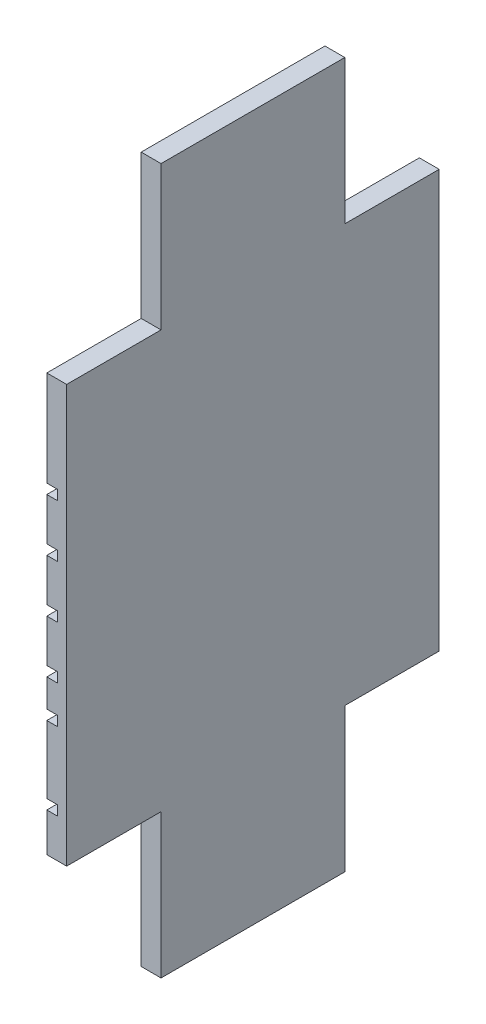
ISO-10303-21;
HEADER;
FILE_DESCRIPTION(('STEP AP214'),'2;1');
FILE_NAME('part.step','',(''),(''),'','','');
FILE_SCHEMA(('AUTOMOTIVE_DESIGN { 1 0 10303 214 1 1 1 1 }'));
ENDSEC;
DATA;
#1=APPLICATION_CONTEXT('core data for automotive mechanical design processes');
#2=APPLICATION_PROTOCOL_DEFINITION('international standard','automotive_design',2000,#1);
#3=PRODUCT_CONTEXT('',#1,'mechanical');
#4=PRODUCT('Part','Part','',(#3));
#5=PRODUCT_RELATED_PRODUCT_CATEGORY('part','',(#4));
#6=PRODUCT_DEFINITION_FORMATION('','',#4);
#7=PRODUCT_DEFINITION_CONTEXT('part definition',#1,'design');
#8=PRODUCT_DEFINITION('design','',#6,#7);
#9=PRODUCT_DEFINITION_SHAPE('','',#8);
#10=(LENGTH_UNIT() NAMED_UNIT(*) SI_UNIT(.MILLI.,.METRE.));
#11=(NAMED_UNIT(*) PLANE_ANGLE_UNIT() SI_UNIT($,.RADIAN.));
#12=(NAMED_UNIT(*) SI_UNIT($,.STERADIAN.) SOLID_ANGLE_UNIT());
#13=UNCERTAINTY_MEASURE_WITH_UNIT(LENGTH_MEASURE(1.E-05),#10,'distance_accuracy_value','');
#14=(GEOMETRIC_REPRESENTATION_CONTEXT(3) GLOBAL_UNCERTAINTY_ASSIGNED_CONTEXT((#13)) GLOBAL_UNIT_ASSIGNED_CONTEXT((#10,
#11,#12)) REPRESENTATION_CONTEXT('',''));
#15=CARTESIAN_POINT('',(0.,0.,0.));
#16=DIRECTION('',(0.,0.,1.));
#17=DIRECTION('',(1.,0.,0.));
#18=AXIS2_PLACEMENT_3D('',#15,#16,#17);
#19=CARTESIAN_POINT('',(102.,-8.,1.35513401620469E-13));
#20=DIRECTION('',(0.,1.,0.));
#21=DIRECTION('',(0.,0.,1.));
#22=AXIS2_PLACEMENT_3D('',#19,#20,#21);
#23=PLANE('',#22);
#24=DIRECTION('',(1.,0.,0.));
#25=VECTOR('',#24,1.);
#26=CARTESIAN_POINT('',(102.,-8.00000000000078,-55.9999999999988));
#27=LINE('',#26,#25);
#28=CARTESIAN_POINT('',(98.,-8.00000000000078,-55.9999999999988));
#29=VERTEX_POINT('',#28);
#30=CARTESIAN_POINT('',(102.,-8.00000000000078,-55.9999999999988));
#31=VERTEX_POINT('',#30);
#32=EDGE_CURVE('E286',#29,#31,#27,.T.);
#33=ORIENTED_EDGE('',*,*,#32,.F.);
#34=DIRECTION('',(0.,0.,-1.));
#35=VECTOR('',#34,1.);
#36=CARTESIAN_POINT('',(98.,-8.,1.36253550303553E-13));
#37=LINE('',#36,#35);
#38=CARTESIAN_POINT('',(98.,-8.00000000000105,-74.9999999999999));
#39=VERTEX_POINT('',#38);
#40=EDGE_CURVE('E357',#29,#39,#37,.T.);
#41=ORIENTED_EDGE('',*,*,#40,.T.);
#42=DIRECTION('',(-1.,0.,0.));
#43=VECTOR('',#42,1.);
#44=CARTESIAN_POINT('',(102.,-8.00000000000105,-74.9999999999999));
#45=LINE('',#44,#43);
#46=CARTESIAN_POINT('',(102.,-8.00000000000105,-74.9999999999999));
#47=VERTEX_POINT('',#46);
#48=EDGE_CURVE('E421',#47,#39,#45,.T.);
#49=ORIENTED_EDGE('',*,*,#48,.F.);
#50=DIRECTION('',(0.,0.,-1.));
#51=VECTOR('',#50,1.);
#52=CARTESIAN_POINT('',(102.,-8.,1.35513401620469E-13));
#53=LINE('',#52,#51);
#54=EDGE_CURVE('E50',#31,#47,#53,.T.);
#55=ORIENTED_EDGE('',*,*,#54,.F.);
#56=EDGE_LOOP('',(#33,#41,#49,#55));
#57=FACE_BOUND('',#56,.T.);
#58=ADVANCED_FACE('F33',(#57),#23,.F.);
#59=DIRECTION('',(-1.,0.,0.));
#60=VECTOR('',#59,1.);
#61=CARTESIAN_POINT('',(102.,-8.00000000000027,-18.9999999999989));
#62=LINE('',#61,#60);
#63=CARTESIAN_POINT('',(102.,-8.00000000000027,-18.9999999999989));
#64=VERTEX_POINT('',#63);
#65=CARTESIAN_POINT('',(98.,-8.00000000000027,-18.9999999999989));
#66=VERTEX_POINT('',#65);
#67=EDGE_CURVE('E58',#64,#66,#62,.T.);
#68=ORIENTED_EDGE('',*,*,#67,.F.);
#69=CARTESIAN_POINT('',(102.,-8.,1.35513401620469E-13));
#70=VERTEX_POINT('',#69);
#71=EDGE_CURVE('E290',#70,#64,#53,.T.);
#72=ORIENTED_EDGE('',*,*,#71,.F.);
#73=DIRECTION('',(-1.,0.,0.));
#74=VECTOR('',#73,1.);
#75=CARTESIAN_POINT('',(102.,-8.,1.35513401620469E-13));
#76=LINE('',#75,#74);
#77=CARTESIAN_POINT('',(98.,-8.,1.36253550303553E-13));
#78=VERTEX_POINT('',#77);
#79=EDGE_CURVE('E418',#70,#78,#76,.T.);
#80=ORIENTED_EDGE('',*,*,#79,.T.);
#81=EDGE_CURVE('E353',#78,#66,#37,.T.);
#82=ORIENTED_EDGE('',*,*,#81,.T.);
#83=EDGE_LOOP('',(#68,#72,#80,#82));
#84=FACE_BOUND('',#83,.T.);
#85=ADVANCED_FACE('F455',(#84),#23,.F.);
#86=CARTESIAN_POINT('',(102.,76.,1.35513401620469E-13));
#87=DIRECTION('',(0.,-1.,0.));
#88=DIRECTION('',(0.,0.,-1.));
#89=AXIS2_PLACEMENT_3D('',#86,#87,#88);
#90=PLANE('',#89);
#91=DIRECTION('',(-1.,0.,0.));
#92=VECTOR('',#91,1.);
#93=CARTESIAN_POINT('',(98.,76.,-56.));
#94=LINE('',#93,#92);
#95=CARTESIAN_POINT('',(102.,76.,-56.));
#96=VERTEX_POINT('',#95);
#97=CARTESIAN_POINT('',(98.,76.,-56.));
#98=VERTEX_POINT('',#97);
#99=EDGE_CURVE('E294',#96,#98,#94,.T.);
#100=ORIENTED_EDGE('',*,*,#99,.F.);
#101=DIRECTION('',(0.,0.,1.));
#102=VECTOR('',#101,1.);
#103=CARTESIAN_POINT('',(102.,76.,1.35513401620469E-13));
#104=LINE('',#103,#102);
#105=CARTESIAN_POINT('',(102.,76.,-74.9999999999999));
#106=VERTEX_POINT('',#105);
#107=EDGE_CURVE('E430',#106,#96,#104,.T.);
#108=ORIENTED_EDGE('',*,*,#107,.F.);
#109=DIRECTION('',(-1.,0.,0.));
#110=VECTOR('',#109,1.);
#111=CARTESIAN_POINT('',(102.,76.,-74.9999999999999));
#112=LINE('',#111,#110);
#113=CARTESIAN_POINT('',(98.,76.,-74.9999999999999));
#114=VERTEX_POINT('',#113);
#115=EDGE_CURVE('E423',#106,#114,#112,.T.);
#116=ORIENTED_EDGE('',*,*,#115,.T.);
#117=DIRECTION('',(0.,0.,1.));
#118=VECTOR('',#117,1.);
#119=CARTESIAN_POINT('',(98.,76.,1.36253550303553E-13));
#120=LINE('',#119,#118);
#121=EDGE_CURVE('E376',#114,#98,#120,.T.);
#122=ORIENTED_EDGE('',*,*,#121,.T.);
#123=EDGE_LOOP('',(#100,#108,#116,#122));
#124=FACE_BOUND('',#123,.T.);
#125=ADVANCED_FACE('F651',(#124),#90,.F.);
#126=DIRECTION('',(1.,0.,0.));
#127=VECTOR('',#126,1.);
#128=CARTESIAN_POINT('',(98.,76.,-19.));
#129=LINE('',#128,#127);
#130=CARTESIAN_POINT('',(98.,76.,-19.));
#131=VERTEX_POINT('',#130);
#132=CARTESIAN_POINT('',(102.,76.,-19.));
#133=VERTEX_POINT('',#132);
#134=EDGE_CURVE('E291',#131,#133,#129,.T.);
#135=ORIENTED_EDGE('',*,*,#134,.F.);
#136=CARTESIAN_POINT('',(98.,76.,1.36253550303553E-13));
#137=VERTEX_POINT('',#136);
#138=EDGE_CURVE('E367',#131,#137,#120,.T.);
#139=ORIENTED_EDGE('',*,*,#138,.T.);
#140=DIRECTION('',(-1.,0.,0.));
#141=VECTOR('',#140,1.);
#142=CARTESIAN_POINT('',(102.,76.,1.35513401620469E-13));
#143=LINE('',#142,#141);
#144=CARTESIAN_POINT('',(102.,76.,1.35513401620469E-13));
#145=VERTEX_POINT('',#144);
#146=EDGE_CURVE('E371',#145,#137,#143,.T.);
#147=ORIENTED_EDGE('',*,*,#146,.F.);
#148=EDGE_CURVE('E328',#133,#145,#104,.T.);
#149=ORIENTED_EDGE('',*,*,#148,.F.);
#150=EDGE_LOOP('',(#135,#139,#147,#149));
#151=FACE_BOUND('',#150,.T.);
#152=ADVANCED_FACE('F664',(#151),#90,.F.);
#153=CARTESIAN_POINT('',(102.,-8.,1.35513401620469E-13));
#154=DIRECTION('',(0.,0.,-1.));
#155=DIRECTION('',(-1.,0.,0.));
#156=AXIS2_PLACEMENT_3D('',#153,#154,#155);
#157=PLANE('',#156);
#158=DIRECTION('',(-1.,0.,0.));
#159=VECTOR('',#158,1.);
#160=CARTESIAN_POINT('',(102.,56.7875,1.35513401620469E-13));
#161=LINE('',#160,#159);
#162=CARTESIAN_POINT('',(100.2,56.7875,1.38777878078145E-13));
#163=VERTEX_POINT('',#162);
#164=CARTESIAN_POINT('',(98.,56.7875,1.36253550400505E-13));
#165=VERTEX_POINT('',#164);
#166=EDGE_CURVE('E570',#163,#165,#161,.T.);
#167=ORIENTED_EDGE('',*,*,#166,.F.);
#168=DIRECTION('',(0.,1.,0.));
#169=VECTOR('',#168,1.);
#170=CARTESIAN_POINT('',(100.2,-8.,1.35846468527857E-13));
#171=LINE('',#170,#169);
#172=CARTESIAN_POINT('',(100.2,54.8,1.38777878078145E-13));
#173=VERTEX_POINT('',#172);
#174=EDGE_CURVE('E566',#173,#163,#171,.T.);
#175=ORIENTED_EDGE('',*,*,#174,.F.);
#176=DIRECTION('',(-1.,0.,0.));
#177=VECTOR('',#176,1.);
#178=CARTESIAN_POINT('',(102.,54.8,1.35513401620469E-13));
#179=LINE('',#178,#177);
#180=CARTESIAN_POINT('',(98.,54.8,1.36253550400505E-13));
#181=VERTEX_POINT('',#180);
#182=EDGE_CURVE('E574',#173,#181,#179,.T.);
#183=ORIENTED_EDGE('',*,*,#182,.T.);
#184=DIRECTION('',(0.,-1.,0.));
#185=VECTOR('',#184,1.);
#186=CARTESIAN_POINT('',(98.,-8.,1.36253550303553E-13));
#187=LINE('',#186,#185);
#188=CARTESIAN_POINT('',(98.,46.1875,1.36253550400505E-13));
#189=VERTEX_POINT('',#188);
#190=EDGE_CURVE('E467',#181,#189,#187,.T.);
#191=ORIENTED_EDGE('',*,*,#190,.T.);
#192=DIRECTION('',(-1.,0.,0.));
#193=VECTOR('',#192,1.);
#194=CARTESIAN_POINT('',(102.,46.1875,1.35513401620469E-13));
#195=LINE('',#194,#193);
#196=CARTESIAN_POINT('',(100.2,46.1875,1.38777878078145E-13));
#197=VERTEX_POINT('',#196);
#198=EDGE_CURVE('E551',#197,#189,#195,.T.);
#199=ORIENTED_EDGE('',*,*,#198,.F.);
#200=DIRECTION('',(0.,1.,0.));
#201=VECTOR('',#200,1.);
#202=CARTESIAN_POINT('',(100.2,-8.,1.35846468527857E-13));
#203=LINE('',#202,#201);
#204=CARTESIAN_POINT('',(100.2,44.2,1.38777878078145E-13));
#205=VERTEX_POINT('',#204);
#206=EDGE_CURVE('E547',#205,#197,#203,.T.);
#207=ORIENTED_EDGE('',*,*,#206,.F.);
#208=DIRECTION('',(-1.,0.,0.));
#209=VECTOR('',#208,1.);
#210=CARTESIAN_POINT('',(102.,44.2,1.35513401620469E-13));
#211=LINE('',#210,#209);
#212=CARTESIAN_POINT('',(98.,44.2,1.36253550400505E-13));
#213=VERTEX_POINT('',#212);
#214=EDGE_CURVE('E556',#205,#213,#211,.T.);
#215=ORIENTED_EDGE('',*,*,#214,.T.);
#216=CARTESIAN_POINT('',(98.,35.5875,1.36253550400505E-13));
#217=VERTEX_POINT('',#216);
#218=EDGE_CURVE('E468',#213,#217,#187,.T.);
#219=ORIENTED_EDGE('',*,*,#218,.T.);
#220=DIRECTION('',(-1.,0.,0.));
#221=VECTOR('',#220,1.);
#222=CARTESIAN_POINT('',(102.,35.5875,1.35513401620469E-13));
#223=LINE('',#222,#221);
#224=CARTESIAN_POINT('',(100.2,35.5875,1.38777878078145E-13));
#225=VERTEX_POINT('',#224);
#226=EDGE_CURVE('E532',#225,#217,#223,.T.);
#227=ORIENTED_EDGE('',*,*,#226,.F.);
#228=DIRECTION('',(0.,1.,0.));
#229=VECTOR('',#228,1.);
#230=CARTESIAN_POINT('',(100.2,-8.,1.35846468527857E-13));
#231=LINE('',#230,#229);
#232=CARTESIAN_POINT('',(100.2,33.6,1.38777878078145E-13));
#233=VERTEX_POINT('',#232);
#234=EDGE_CURVE('E528',#233,#225,#231,.T.);
#235=ORIENTED_EDGE('',*,*,#234,.F.);
#236=DIRECTION('',(-1.,0.,0.));
#237=VECTOR('',#236,1.);
#238=CARTESIAN_POINT('',(102.,33.6,1.35513401620469E-13));
#239=LINE('',#238,#237);
#240=CARTESIAN_POINT('',(98.,33.6,1.36253550400505E-13));
#241=VERTEX_POINT('',#240);
#242=EDGE_CURVE('E537',#233,#241,#239,.T.);
#243=ORIENTED_EDGE('',*,*,#242,.T.);
#244=CARTESIAN_POINT('',(98.,24.9875,1.36253550400505E-13));
#245=VERTEX_POINT('',#244);
#246=EDGE_CURVE('E624',#241,#245,#187,.T.);
#247=ORIENTED_EDGE('',*,*,#246,.T.);
#248=DIRECTION('',(-1.,0.,0.));
#249=VECTOR('',#248,1.);
#250=CARTESIAN_POINT('',(102.,24.9875,1.35513401620469E-13));
#251=LINE('',#250,#249);
#252=CARTESIAN_POINT('',(100.2,24.9875,1.38777878078145E-13));
#253=VERTEX_POINT('',#252);
#254=EDGE_CURVE('E513',#253,#245,#251,.T.);
#255=ORIENTED_EDGE('',*,*,#254,.F.);
#256=DIRECTION('',(0.,1.,0.));
#257=VECTOR('',#256,1.);
#258=CARTESIAN_POINT('',(100.2,-8.,1.35846468527857E-13));
#259=LINE('',#258,#257);
#260=CARTESIAN_POINT('',(100.2,23.,1.38777878078145E-13));
#261=VERTEX_POINT('',#260);
#262=EDGE_CURVE('E511',#261,#253,#259,.T.);
#263=ORIENTED_EDGE('',*,*,#262,.F.);
#264=DIRECTION('',(-1.,0.,0.));
#265=VECTOR('',#264,1.);
#266=CARTESIAN_POINT('',(102.,23.,1.35513401620469E-13));
#267=LINE('',#266,#265);
#268=CARTESIAN_POINT('',(98.,23.,1.36253550400505E-13));
#269=VERTEX_POINT('',#268);
#270=EDGE_CURVE('E518',#261,#269,#267,.T.);
#271=ORIENTED_EDGE('',*,*,#270,.T.);
#272=CARTESIAN_POINT('',(98.,17.3875,1.36253550400505E-13));
#273=VERTEX_POINT('',#272);
#274=EDGE_CURVE('E471',#269,#273,#187,.T.);
#275=ORIENTED_EDGE('',*,*,#274,.T.);
#276=DIRECTION('',(1.,0.,0.));
#277=VECTOR('',#276,1.);
#278=CARTESIAN_POINT('',(102.,17.3875,1.35513401620469E-13));
#279=LINE('',#278,#277);
#280=CARTESIAN_POINT('',(100.2,17.3875,1.36050009415705E-13));
#281=VERTEX_POINT('',#280);
#282=EDGE_CURVE('E495',#273,#281,#279,.T.);
#283=ORIENTED_EDGE('',*,*,#282,.T.);
#284=DIRECTION('',(0.,1.,0.));
#285=VECTOR('',#284,1.);
#286=CARTESIAN_POINT('',(100.2,-8.,1.35846468527857E-13));
#287=LINE('',#286,#285);
#288=CARTESIAN_POINT('',(100.2,15.4,1.36050009415705E-13));
#289=VERTEX_POINT('',#288);
#290=EDGE_CURVE('E493',#289,#281,#287,.T.);
#291=ORIENTED_EDGE('',*,*,#290,.F.);
#292=DIRECTION('',(1.,0.,0.));
#293=VECTOR('',#292,1.);
#294=CARTESIAN_POINT('',(102.,15.4,1.35513401620469E-13));
#295=LINE('',#294,#293);
#296=CARTESIAN_POINT('',(98.,15.4,1.36253550400505E-13));
#297=VERTEX_POINT('',#296);
#298=EDGE_CURVE('E501',#297,#289,#295,.T.);
#299=ORIENTED_EDGE('',*,*,#298,.F.);
#300=CARTESIAN_POINT('',(98.,1.7875,1.36253550400505E-13));
#301=VERTEX_POINT('',#300);
#302=EDGE_CURVE('E469',#297,#301,#187,.T.);
#303=ORIENTED_EDGE('',*,*,#302,.T.);
#304=DIRECTION('',(-1.,0.,0.));
#305=VECTOR('',#304,1.);
#306=CARTESIAN_POINT('',(102.,1.7875,1.35513401620469E-13));
#307=LINE('',#306,#305);
#308=CARTESIAN_POINT('',(100.2,1.7875,1.38777878078145E-13));
#309=VERTEX_POINT('',#308);
#310=EDGE_CURVE('E472',#309,#301,#307,.T.);
#311=ORIENTED_EDGE('',*,*,#310,.F.);
#312=DIRECTION('',(0.,1.,0.));
#313=VECTOR('',#312,1.);
#314=CARTESIAN_POINT('',(100.2,-8.,1.35846468527857E-13));
#315=LINE('',#314,#313);
#316=CARTESIAN_POINT('',(100.2,-0.2,1.38777878078145E-13));
#317=VERTEX_POINT('',#316);
#318=EDGE_CURVE('E470',#317,#309,#315,.T.);
#319=ORIENTED_EDGE('',*,*,#318,.F.);
#320=DIRECTION('',(-1.,0.,0.));
#321=VECTOR('',#320,1.);
#322=CARTESIAN_POINT('',(102.,-0.2,1.35513401620469E-13));
#323=LINE('',#322,#321);
#324=CARTESIAN_POINT('',(98.,-0.2,1.36253550400505E-13));
#325=VERTEX_POINT('',#324);
#326=EDGE_CURVE('E483',#317,#325,#323,.T.);
#327=ORIENTED_EDGE('',*,*,#326,.T.);
#328=EDGE_CURVE('E453',#325,#78,#187,.T.);
#329=ORIENTED_EDGE('',*,*,#328,.T.);
#330=ORIENTED_EDGE('',*,*,#79,.F.);
#331=DIRECTION('',(0.,-1.,0.));
#332=VECTOR('',#331,1.);
#333=CARTESIAN_POINT('',(102.,-8.,1.35513401620469E-13));
#334=LINE('',#333,#332);
#335=EDGE_CURVE('E377',#145,#70,#334,.T.);
#336=ORIENTED_EDGE('',*,*,#335,.F.);
#337=ORIENTED_EDGE('',*,*,#146,.T.);
#338=EDGE_CURVE('E362',#137,#165,#187,.T.);
#339=ORIENTED_EDGE('',*,*,#338,.T.);
#340=EDGE_LOOP('',(#167,#175,#183,#191,#199,#207,#215,#219,#227,#235,#243,#247,#255,#263,#271,
#275,#283,#291,#299,#303,#311,#319,#327,#329,#330,#336,#337,#339));
#341=FACE_BOUND('',#340,.T.);
#342=ADVANCED_FACE('F35',(#341),#157,.F.);
#343=CARTESIAN_POINT('',(102.,-8.00000000000105,-74.9999999999999));
#344=DIRECTION('',(0.,0.,1.));
#345=DIRECTION('',(1.,0.,0.));
#346=AXIS2_PLACEMENT_3D('',#343,#344,#345);
#347=PLANE('',#346);
#348=DIRECTION('',(1.,0.,0.));
#349=VECTOR('',#348,1.);
#350=CARTESIAN_POINT('',(102.,56.7875,-74.9999999999999));
#351=LINE('',#350,#349);
#352=CARTESIAN_POINT('',(98.,56.7875,-74.9999999999999));
#353=VERTEX_POINT('',#352);
#354=CARTESIAN_POINT('',(100.2,56.7875,-74.9999999999999));
#355=VERTEX_POINT('',#354);
#356=EDGE_CURVE('E572',#353,#355,#351,.T.);
#357=ORIENTED_EDGE('',*,*,#356,.F.);
#358=DIRECTION('',(0.,1.,0.));
#359=VECTOR('',#358,1.);
#360=CARTESIAN_POINT('',(98.,-8.00000000000105,-74.9999999999999));
#361=LINE('',#360,#359);
#362=EDGE_CURVE('E356',#353,#114,#361,.T.);
#363=ORIENTED_EDGE('',*,*,#362,.T.);
#364=ORIENTED_EDGE('',*,*,#115,.F.);
#365=DIRECTION('',(0.,1.,0.));
#366=VECTOR('',#365,1.);
#367=CARTESIAN_POINT('',(102.,-8.00000000000105,-74.9999999999999));
#368=LINE('',#367,#366);
#369=EDGE_CURVE('E438',#47,#106,#368,.T.);
#370=ORIENTED_EDGE('',*,*,#369,.F.);
#371=ORIENTED_EDGE('',*,*,#48,.T.);
#372=CARTESIAN_POINT('',(98.,-0.2,-74.9999999999999));
#373=VERTEX_POINT('',#372);
#374=EDGE_CURVE('E363',#39,#373,#361,.T.);
#375=ORIENTED_EDGE('',*,*,#374,.T.);
#376=DIRECTION('',(1.,0.,0.));
#377=VECTOR('',#376,1.);
#378=CARTESIAN_POINT('',(102.,-0.2,-74.9999999999999));
#379=LINE('',#378,#377);
#380=CARTESIAN_POINT('',(100.2,-0.2,-74.9999999999999));
#381=VERTEX_POINT('',#380);
#382=EDGE_CURVE('E485',#373,#381,#379,.T.);
#383=ORIENTED_EDGE('',*,*,#382,.T.);
#384=DIRECTION('',(0.,-1.,0.));
#385=VECTOR('',#384,1.);
#386=CARTESIAN_POINT('',(100.2,-8.00000000000105,-74.9999999999999));
#387=LINE('',#386,#385);
#388=CARTESIAN_POINT('',(100.2,1.7875,-74.9999999999999));
#389=VERTEX_POINT('',#388);
#390=EDGE_CURVE('E411',#389,#381,#387,.T.);
#391=ORIENTED_EDGE('',*,*,#390,.F.);
#392=DIRECTION('',(1.,0.,0.));
#393=VECTOR('',#392,1.);
#394=CARTESIAN_POINT('',(102.,1.7875,-74.9999999999999));
#395=LINE('',#394,#393);
#396=CARTESIAN_POINT('',(98.,1.7875,-74.9999999999999));
#397=VERTEX_POINT('',#396);
#398=EDGE_CURVE('E479',#397,#389,#395,.T.);
#399=ORIENTED_EDGE('',*,*,#398,.F.);
#400=CARTESIAN_POINT('',(98.,15.4,-74.9999999999999));
#401=VERTEX_POINT('',#400);
#402=EDGE_CURVE('E368',#397,#401,#361,.T.);
#403=ORIENTED_EDGE('',*,*,#402,.T.);
#404=DIRECTION('',(-1.,0.,0.));
#405=VECTOR('',#404,1.);
#406=CARTESIAN_POINT('',(102.,15.4,-74.9999999999999));
#407=LINE('',#406,#405);
#408=CARTESIAN_POINT('',(100.2,15.4,-74.9999999999999));
#409=VERTEX_POINT('',#408);
#410=EDGE_CURVE('E503',#409,#401,#407,.T.);
#411=ORIENTED_EDGE('',*,*,#410,.F.);
#412=DIRECTION('',(0.,-1.,0.));
#413=VECTOR('',#412,1.);
#414=CARTESIAN_POINT('',(100.2,-8.00000000000105,-74.9999999999999));
#415=LINE('',#414,#413);
#416=CARTESIAN_POINT('',(100.2,17.3875,-74.9999999999999));
#417=VERTEX_POINT('',#416);
#418=EDGE_CURVE('E404',#417,#409,#415,.T.);
#419=ORIENTED_EDGE('',*,*,#418,.F.);
#420=DIRECTION('',(-1.,0.,0.));
#421=VECTOR('',#420,1.);
#422=CARTESIAN_POINT('',(102.,17.3875,-74.9999999999999));
#423=LINE('',#422,#421);
#424=CARTESIAN_POINT('',(98.,17.3875,-74.9999999999999));
#425=VERTEX_POINT('',#424);
#426=EDGE_CURVE('E498',#417,#425,#423,.T.);
#427=ORIENTED_EDGE('',*,*,#426,.T.);
#428=CARTESIAN_POINT('',(98.,23.,-74.9999999999999));
#429=VERTEX_POINT('',#428);
#430=EDGE_CURVE('E640',#425,#429,#361,.T.);
#431=ORIENTED_EDGE('',*,*,#430,.T.);
#432=DIRECTION('',(1.,0.,0.));
#433=VECTOR('',#432,1.);
#434=CARTESIAN_POINT('',(102.,23.,-74.9999999999999));
#435=LINE('',#434,#433);
#436=CARTESIAN_POINT('',(100.2,23.,-74.9999999999999));
#437=VERTEX_POINT('',#436);
#438=EDGE_CURVE('E521',#429,#437,#435,.T.);
#439=ORIENTED_EDGE('',*,*,#438,.T.);
#440=DIRECTION('',(0.,-1.,0.));
#441=VECTOR('',#440,1.);
#442=CARTESIAN_POINT('',(100.2,-8.00000000000105,-74.9999999999999));
#443=LINE('',#442,#441);
#444=CARTESIAN_POINT('',(100.2,24.9875,-74.9999999999999));
#445=VERTEX_POINT('',#444);
#446=EDGE_CURVE('E397',#445,#437,#443,.T.);
#447=ORIENTED_EDGE('',*,*,#446,.F.);
#448=DIRECTION('',(1.,0.,0.));
#449=VECTOR('',#448,1.);
#450=CARTESIAN_POINT('',(102.,24.9875,-74.9999999999999));
#451=LINE('',#450,#449);
#452=CARTESIAN_POINT('',(98.,24.9875,-74.9999999999999));
#453=VERTEX_POINT('',#452);
#454=EDGE_CURVE('E516',#453,#445,#451,.T.);
#455=ORIENTED_EDGE('',*,*,#454,.F.);
#456=CARTESIAN_POINT('',(98.,33.6,-74.9999999999999));
#457=VERTEX_POINT('',#456);
#458=EDGE_CURVE('E641',#453,#457,#361,.T.);
#459=ORIENTED_EDGE('',*,*,#458,.T.);
#460=DIRECTION('',(1.,0.,0.));
#461=VECTOR('',#460,1.);
#462=CARTESIAN_POINT('',(102.,33.6,-74.9999999999999));
#463=LINE('',#462,#461);
#464=CARTESIAN_POINT('',(100.2,33.6,-74.9999999999999));
#465=VERTEX_POINT('',#464);
#466=EDGE_CURVE('E540',#457,#465,#463,.T.);
#467=ORIENTED_EDGE('',*,*,#466,.T.);
#468=DIRECTION('',(0.,-1.,0.));
#469=VECTOR('',#468,1.);
#470=CARTESIAN_POINT('',(100.2,-8.00000000000105,-74.9999999999999));
#471=LINE('',#470,#469);
#472=CARTESIAN_POINT('',(100.2,35.5875,-74.9999999999999));
#473=VERTEX_POINT('',#472);
#474=EDGE_CURVE('E390',#473,#465,#471,.T.);
#475=ORIENTED_EDGE('',*,*,#474,.F.);
#476=DIRECTION('',(1.,0.,0.));
#477=VECTOR('',#476,1.);
#478=CARTESIAN_POINT('',(102.,35.5875,-74.9999999999999));
#479=LINE('',#478,#477);
#480=CARTESIAN_POINT('',(98.,35.5875,-74.9999999999999));
#481=VERTEX_POINT('',#480);
#482=EDGE_CURVE('E535',#481,#473,#479,.T.);
#483=ORIENTED_EDGE('',*,*,#482,.F.);
#484=CARTESIAN_POINT('',(98.,44.2,-74.9999999999999));
#485=VERTEX_POINT('',#484);
#486=EDGE_CURVE('E616',#481,#485,#361,.T.);
#487=ORIENTED_EDGE('',*,*,#486,.T.);
#488=DIRECTION('',(1.,0.,0.));
#489=VECTOR('',#488,1.);
#490=CARTESIAN_POINT('',(102.,44.2,-74.9999999999999));
#491=LINE('',#490,#489);
#492=CARTESIAN_POINT('',(100.2,44.2,-74.9999999999999));
#493=VERTEX_POINT('',#492);
#494=EDGE_CURVE('E559',#485,#493,#491,.T.);
#495=ORIENTED_EDGE('',*,*,#494,.T.);
#496=DIRECTION('',(0.,-1.,0.));
#497=VECTOR('',#496,1.);
#498=CARTESIAN_POINT('',(100.2,-8.00000000000105,-74.9999999999999));
#499=LINE('',#498,#497);
#500=CARTESIAN_POINT('',(100.2,46.1875,-74.9999999999999));
#501=VERTEX_POINT('',#500);
#502=EDGE_CURVE('E383',#501,#493,#499,.T.);
#503=ORIENTED_EDGE('',*,*,#502,.F.);
#504=DIRECTION('',(1.,0.,0.));
#505=VECTOR('',#504,1.);
#506=CARTESIAN_POINT('',(102.,46.1875,-74.9999999999999));
#507=LINE('',#506,#505);
#508=CARTESIAN_POINT('',(98.,46.1875,-74.9999999999999));
#509=VERTEX_POINT('',#508);
#510=EDGE_CURVE('E554',#509,#501,#507,.T.);
#511=ORIENTED_EDGE('',*,*,#510,.F.);
#512=CARTESIAN_POINT('',(98.,54.8,-74.9999999999999));
#513=VERTEX_POINT('',#512);
#514=EDGE_CURVE('E597',#509,#513,#361,.T.);
#515=ORIENTED_EDGE('',*,*,#514,.T.);
#516=DIRECTION('',(1.,0.,0.));
#517=VECTOR('',#516,1.);
#518=CARTESIAN_POINT('',(102.,54.8,-74.9999999999999));
#519=LINE('',#518,#517);
#520=CARTESIAN_POINT('',(100.2,54.8,-74.9999999999999));
#521=VERTEX_POINT('',#520);
#522=EDGE_CURVE('E577',#513,#521,#519,.T.);
#523=ORIENTED_EDGE('',*,*,#522,.T.);
#524=DIRECTION('',(0.,-1.,0.));
#525=VECTOR('',#524,1.);
#526=CARTESIAN_POINT('',(100.2,-8.00000000000105,-74.9999999999999));
#527=LINE('',#526,#525);
#528=EDGE_CURVE('E11',#355,#521,#527,.T.);
#529=ORIENTED_EDGE('',*,*,#528,.F.);
#530=EDGE_LOOP('',(#357,#363,#364,#370,#371,#375,#383,#391,#399,#403,#411,#419,#427,#431,#439,
#447,#455,#459,#467,#475,#483,#487,#495,#503,#511,#515,#523,#529));
#531=FACE_BOUND('',#530,.T.);
#532=ADVANCED_FACE('F592',(#531),#347,.F.);
#533=CARTESIAN_POINT('',(98.,0.,0.));
#534=DIRECTION('',(-1.,0.,0.));
#535=DIRECTION('',(0.,0.,1.));
#536=AXIS2_PLACEMENT_3D('',#533,#534,#535);
#537=PLANE('',#536);
#538=ORIENTED_EDGE('',*,*,#362,.F.);
#539=DIRECTION('',(0.,0.,1.));
#540=VECTOR('',#539,1.);
#541=CARTESIAN_POINT('',(98.,56.7875,0.));
#542=LINE('',#541,#540);
#543=EDGE_CURVE('E42',#353,#165,#542,.T.);
#544=ORIENTED_EDGE('',*,*,#543,.T.);
#545=ORIENTED_EDGE('',*,*,#338,.F.);
#546=ORIENTED_EDGE('',*,*,#138,.F.);
#547=DIRECTION('',(0.,-1.,0.));
#548=VECTOR('',#547,1.);
#549=CARTESIAN_POINT('',(98.,105.,-19.));
#550=LINE('',#549,#548);
#551=CARTESIAN_POINT('',(98.,105.,-19.));
#552=VERTEX_POINT('',#551);
#553=EDGE_CURVE('E334',#552,#131,#550,.T.);
#554=ORIENTED_EDGE('',*,*,#553,.F.);
#555=DIRECTION('',(0.,0.,1.));
#556=VECTOR('',#555,1.);
#557=CARTESIAN_POINT('',(98.,105.,-19.));
#558=LINE('',#557,#556);
#559=CARTESIAN_POINT('',(98.,105.,-56.));
#560=VERTEX_POINT('',#559);
#561=EDGE_CURVE('E312',#560,#552,#558,.T.);
#562=ORIENTED_EDGE('',*,*,#561,.F.);
#563=DIRECTION('',(0.,-1.,0.));
#564=VECTOR('',#563,1.);
#565=CARTESIAN_POINT('',(98.,105.,-56.));
#566=LINE('',#565,#564);
#567=EDGE_CURVE('E321',#560,#98,#566,.T.);
#568=ORIENTED_EDGE('',*,*,#567,.T.);
#569=ORIENTED_EDGE('',*,*,#121,.F.);
#570=EDGE_LOOP('',(#538,#544,#545,#546,#554,#562,#568,#569));
#571=FACE_BOUND('',#570,.T.);
#572=ADVANCED_FACE('F648',(#571),#537,.T.);
#573=DIRECTION('',(0.,0.,1.));
#574=VECTOR('',#573,1.);
#575=CARTESIAN_POINT('',(98.,54.8,0.));
#576=LINE('',#575,#574);
#577=EDGE_CURVE('E381',#513,#181,#576,.T.);
#578=ORIENTED_EDGE('',*,*,#577,.F.);
#579=ORIENTED_EDGE('',*,*,#514,.F.);
#580=DIRECTION('',(0.,0.,1.));
#581=VECTOR('',#580,1.);
#582=CARTESIAN_POINT('',(98.,46.1875,0.));
#583=LINE('',#582,#581);
#584=EDGE_CURVE('E385',#509,#189,#583,.T.);
#585=ORIENTED_EDGE('',*,*,#584,.T.);
#586=ORIENTED_EDGE('',*,*,#190,.F.);
#587=EDGE_LOOP('',(#578,#579,#585,#586));
#588=FACE_BOUND('',#587,.T.);
#589=ADVANCED_FACE('F603',(#588),#537,.T.);
#590=DIRECTION('',(0.,0.,1.));
#591=VECTOR('',#590,1.);
#592=CARTESIAN_POINT('',(98.,44.2,0.));
#593=LINE('',#592,#591);
#594=EDGE_CURVE('E388',#485,#213,#593,.T.);
#595=ORIENTED_EDGE('',*,*,#594,.F.);
#596=ORIENTED_EDGE('',*,*,#486,.F.);
#597=DIRECTION('',(0.,0.,1.));
#598=VECTOR('',#597,1.);
#599=CARTESIAN_POINT('',(98.,35.5875,0.));
#600=LINE('',#599,#598);
#601=EDGE_CURVE('E392',#481,#217,#600,.T.);
#602=ORIENTED_EDGE('',*,*,#601,.T.);
#603=ORIENTED_EDGE('',*,*,#218,.F.);
#604=EDGE_LOOP('',(#595,#596,#602,#603));
#605=FACE_BOUND('',#604,.T.);
#606=ADVANCED_FACE('F622',(#605),#537,.T.);
#607=DIRECTION('',(0.,0.,1.));
#608=VECTOR('',#607,1.);
#609=CARTESIAN_POINT('',(98.,33.6,0.));
#610=LINE('',#609,#608);
#611=EDGE_CURVE('E395',#457,#241,#610,.T.);
#612=ORIENTED_EDGE('',*,*,#611,.F.);
#613=ORIENTED_EDGE('',*,*,#458,.F.);
#614=DIRECTION('',(0.,0.,1.));
#615=VECTOR('',#614,1.);
#616=CARTESIAN_POINT('',(98.,24.9875,0.));
#617=LINE('',#616,#615);
#618=EDGE_CURVE('E399',#453,#245,#617,.T.);
#619=ORIENTED_EDGE('',*,*,#618,.T.);
#620=ORIENTED_EDGE('',*,*,#246,.F.);
#621=EDGE_LOOP('',(#612,#613,#619,#620));
#622=FACE_BOUND('',#621,.T.);
#623=ADVANCED_FACE('F698',(#622),#537,.T.);
#624=ORIENTED_EDGE('',*,*,#302,.F.);
#625=DIRECTION('',(0.,0.,-1.));
#626=VECTOR('',#625,1.);
#627=CARTESIAN_POINT('',(98.,15.4,0.));
#628=LINE('',#627,#626);
#629=EDGE_CURVE('E408',#297,#401,#628,.T.);
#630=ORIENTED_EDGE('',*,*,#629,.T.);
#631=ORIENTED_EDGE('',*,*,#402,.F.);
#632=DIRECTION('',(0.,0.,1.));
#633=VECTOR('',#632,1.);
#634=CARTESIAN_POINT('',(98.,1.7875,0.));
#635=LINE('',#634,#633);
#636=EDGE_CURVE('E413',#397,#301,#635,.T.);
#637=ORIENTED_EDGE('',*,*,#636,.T.);
#638=EDGE_LOOP('',(#624,#630,#631,#637));
#639=FACE_BOUND('',#638,.T.);
#640=ADVANCED_FACE('F694',(#639),#537,.T.);
#641=DIRECTION('',(0.,0.,1.));
#642=VECTOR('',#641,1.);
#643=CARTESIAN_POINT('',(98.,23.,0.));
#644=LINE('',#643,#642);
#645=EDGE_CURVE('E402',#429,#269,#644,.T.);
#646=ORIENTED_EDGE('',*,*,#645,.F.);
#647=ORIENTED_EDGE('',*,*,#430,.F.);
#648=DIRECTION('',(0.,0.,-1.));
#649=VECTOR('',#648,1.);
#650=CARTESIAN_POINT('',(98.,17.3875,0.));
#651=LINE('',#650,#649);
#652=EDGE_CURVE('E406',#273,#425,#651,.T.);
#653=ORIENTED_EDGE('',*,*,#652,.F.);
#654=ORIENTED_EDGE('',*,*,#274,.F.);
#655=EDGE_LOOP('',(#646,#647,#653,#654));
#656=FACE_BOUND('',#655,.T.);
#657=ADVANCED_FACE('F638',(#656),#537,.T.);
#658=CARTESIAN_POINT('',(102.,0.,0.));
#659=DIRECTION('',(-1.,0.,0.));
#660=DIRECTION('',(0.,0.,1.));
#661=AXIS2_PLACEMENT_3D('',#658,#659,#660);
#662=PLANE('',#661);
#663=ORIENTED_EDGE('',*,*,#335,.T.);
#664=ORIENTED_EDGE('',*,*,#71,.T.);
#665=DIRECTION('',(0.,1.,0.));
#666=VECTOR('',#665,1.);
#667=CARTESIAN_POINT('',(102.,-37.0000000000003,-18.9999999999985));
#668=LINE('',#667,#666);
#669=CARTESIAN_POINT('',(102.,-37.0000000000003,-18.9999999999985));
#670=VERTEX_POINT('',#669);
#671=EDGE_CURVE('E271',#670,#64,#668,.T.);
#672=ORIENTED_EDGE('',*,*,#671,.F.);
#673=DIRECTION('',(0.,0.,1.));
#674=VECTOR('',#673,1.);
#675=CARTESIAN_POINT('',(102.,-37.0000000000003,-18.9999999999985));
#676=LINE('',#675,#674);
#677=CARTESIAN_POINT('',(102.,-37.0000000000008,-55.9999999999984));
#678=VERTEX_POINT('',#677);
#679=EDGE_CURVE('E277',#678,#670,#676,.T.);
#680=ORIENTED_EDGE('',*,*,#679,.F.);
#681=DIRECTION('',(0.,1.,0.));
#682=VECTOR('',#681,1.);
#683=CARTESIAN_POINT('',(102.,-37.0000000000008,-55.9999999999984));
#684=LINE('',#683,#682);
#685=EDGE_CURVE('E305',#678,#31,#684,.T.);
#686=ORIENTED_EDGE('',*,*,#685,.T.);
#687=ORIENTED_EDGE('',*,*,#54,.T.);
#688=ORIENTED_EDGE('',*,*,#369,.T.);
#689=ORIENTED_EDGE('',*,*,#107,.T.);
#690=DIRECTION('',(0.,-1.,0.));
#691=VECTOR('',#690,1.);
#692=CARTESIAN_POINT('',(102.,105.,-56.));
#693=LINE('',#692,#691);
#694=CARTESIAN_POINT('',(102.,105.,-56.));
#695=VERTEX_POINT('',#694);
#696=EDGE_CURVE('E335',#695,#96,#693,.T.);
#697=ORIENTED_EDGE('',*,*,#696,.F.);
#698=DIRECTION('',(0.,0.,-1.));
#699=VECTOR('',#698,1.);
#700=CARTESIAN_POINT('',(102.,105.,-19.));
#701=LINE('',#700,#699);
#702=CARTESIAN_POINT('',(102.,105.,-19.));
#703=VERTEX_POINT('',#702);
#704=EDGE_CURVE('E317',#703,#695,#701,.T.);
#705=ORIENTED_EDGE('',*,*,#704,.F.);
#706=DIRECTION('',(0.,-1.,0.));
#707=VECTOR('',#706,1.);
#708=CARTESIAN_POINT('',(102.,105.,-19.));
#709=LINE('',#708,#707);
#710=EDGE_CURVE('E331',#703,#133,#709,.T.);
#711=ORIENTED_EDGE('',*,*,#710,.T.);
#712=ORIENTED_EDGE('',*,*,#148,.T.);
#713=EDGE_LOOP('',(#663,#664,#672,#680,#686,#687,#688,#689,#697,#705,#711,#712));
#714=FACE_BOUND('',#713,.T.);
#715=ADVANCED_FACE('F289',(#714),#662,.F.);
#716=DIRECTION('',(0.,0.,1.));
#717=VECTOR('',#716,1.);
#718=CARTESIAN_POINT('',(98.,-0.2,0.));
#719=LINE('',#718,#717);
#720=EDGE_CURVE('E416',#373,#325,#719,.T.);
#721=ORIENTED_EDGE('',*,*,#720,.F.);
#722=ORIENTED_EDGE('',*,*,#374,.F.);
#723=ORIENTED_EDGE('',*,*,#40,.F.);
#724=DIRECTION('',(0.,1.,0.));
#725=VECTOR('',#724,1.);
#726=CARTESIAN_POINT('',(98.,-37.0000000000008,-55.9999999999984));
#727=LINE('',#726,#725);
#728=CARTESIAN_POINT('',(98.,-37.0000000000008,-55.9999999999984));
#729=VERTEX_POINT('',#728);
#730=EDGE_CURVE('E296',#729,#29,#727,.T.);
#731=ORIENTED_EDGE('',*,*,#730,.F.);
#732=DIRECTION('',(0.,0.,-1.));
#733=VECTOR('',#732,1.);
#734=CARTESIAN_POINT('',(98.,-37.0000000000003,-18.9999999999985));
#735=LINE('',#734,#733);
#736=CARTESIAN_POINT('',(98.,-37.0000000000003,-18.9999999999985));
#737=VERTEX_POINT('',#736);
#738=EDGE_CURVE('E276',#737,#729,#735,.T.);
#739=ORIENTED_EDGE('',*,*,#738,.F.);
#740=DIRECTION('',(0.,1.,0.));
#741=VECTOR('',#740,1.);
#742=CARTESIAN_POINT('',(98.,-37.0000000000003,-18.9999999999985));
#743=LINE('',#742,#741);
#744=EDGE_CURVE('E273',#737,#66,#743,.T.);
#745=ORIENTED_EDGE('',*,*,#744,.T.);
#746=ORIENTED_EDGE('',*,*,#81,.F.);
#747=ORIENTED_EDGE('',*,*,#328,.F.);
#748=EDGE_LOOP('',(#721,#722,#723,#731,#739,#745,#746,#747));
#749=FACE_BOUND('',#748,.T.);
#750=ADVANCED_FACE('F458',(#749),#537,.T.);
#751=CARTESIAN_POINT('',(100.2,1.5875,0.));
#752=DIRECTION('',(-1.,0.,0.));
#753=DIRECTION('',(0.,0.,1.));
#754=AXIS2_PLACEMENT_3D('',#751,#752,#753);
#755=PLANE('',#754);
#756=ORIENTED_EDGE('',*,*,#318,.T.);
#757=DIRECTION('',(0.,0.,-1.));
#758=VECTOR('',#757,1.);
#759=CARTESIAN_POINT('',(100.2,1.7875,-34.));
#760=LINE('',#759,#758);
#761=EDGE_CURVE('E488',#309,#389,#760,.T.);
#762=ORIENTED_EDGE('',*,*,#761,.T.);
#763=ORIENTED_EDGE('',*,*,#390,.T.);
#764=DIRECTION('',(0.,0.,-1.));
#765=VECTOR('',#764,1.);
#766=CARTESIAN_POINT('',(100.2,-0.2,-34.));
#767=LINE('',#766,#765);
#768=EDGE_CURVE('E490',#317,#381,#767,.T.);
#769=ORIENTED_EDGE('',*,*,#768,.F.);
#770=EDGE_LOOP('',(#756,#762,#763,#769));
#771=FACE_BOUND('',#770,.T.);
#772=ADVANCED_FACE('F686',(#771),#755,.T.);
#773=CARTESIAN_POINT('',(3.,1.7875,-34.));
#774=DIRECTION('',(0.,-1.,0.));
#775=DIRECTION('',(0.,0.,-1.));
#776=AXIS2_PLACEMENT_3D('',#773,#774,#775);
#777=PLANE('',#776);
#778=ORIENTED_EDGE('',*,*,#310,.T.);
#779=ORIENTED_EDGE('',*,*,#636,.F.);
#780=ORIENTED_EDGE('',*,*,#398,.T.);
#781=ORIENTED_EDGE('',*,*,#761,.F.);
#782=EDGE_LOOP('',(#778,#779,#780,#781));
#783=FACE_BOUND('',#782,.T.);
#784=ADVANCED_FACE('F691',(#783),#777,.T.);
#785=CARTESIAN_POINT('',(3.,-0.2,-34.));
#786=DIRECTION('',(0.,-1.,0.));
#787=DIRECTION('',(0.,0.,-1.));
#788=AXIS2_PLACEMENT_3D('',#785,#786,#787);
#789=PLANE('',#788);
#790=ORIENTED_EDGE('',*,*,#768,.T.);
#791=ORIENTED_EDGE('',*,*,#382,.F.);
#792=ORIENTED_EDGE('',*,*,#720,.T.);
#793=ORIENTED_EDGE('',*,*,#326,.F.);
#794=EDGE_LOOP('',(#790,#791,#792,#793));
#795=FACE_BOUND('',#794,.T.);
#796=ADVANCED_FACE('F712',(#795),#789,.F.);
#797=CARTESIAN_POINT('',(100.2,17.1875,0.));
#798=DIRECTION('',(-1.,0.,0.));
#799=DIRECTION('',(0.,0.,1.));
#800=AXIS2_PLACEMENT_3D('',#797,#798,#799);
#801=PLANE('',#800);
#802=ORIENTED_EDGE('',*,*,#290,.T.);
#803=DIRECTION('',(0.,0.,-1.));
#804=VECTOR('',#803,1.);
#805=CARTESIAN_POINT('',(100.2,17.3875,0.));
#806=LINE('',#805,#804);
#807=EDGE_CURVE('E505',#281,#417,#806,.T.);
#808=ORIENTED_EDGE('',*,*,#807,.T.);
#809=ORIENTED_EDGE('',*,*,#418,.T.);
#810=DIRECTION('',(0.,0.,-1.));
#811=VECTOR('',#810,1.);
#812=CARTESIAN_POINT('',(100.2,15.4,0.));
#813=LINE('',#812,#811);
#814=EDGE_CURVE('E508',#289,#409,#813,.T.);
#815=ORIENTED_EDGE('',*,*,#814,.F.);
#816=EDGE_LOOP('',(#802,#808,#809,#815));
#817=FACE_BOUND('',#816,.T.);
#818=ADVANCED_FACE('F714',(#817),#801,.T.);
#819=CARTESIAN_POINT('',(0.,17.3875,17.5));
#820=DIRECTION('',(0.,1.,0.));
#821=DIRECTION('',(0.,0.,1.));
#822=AXIS2_PLACEMENT_3D('',#819,#820,#821);
#823=PLANE('',#822);
#824=ORIENTED_EDGE('',*,*,#652,.T.);
#825=ORIENTED_EDGE('',*,*,#426,.F.);
#826=ORIENTED_EDGE('',*,*,#807,.F.);
#827=ORIENTED_EDGE('',*,*,#282,.F.);
#828=EDGE_LOOP('',(#824,#825,#826,#827));
#829=FACE_BOUND('',#828,.T.);
#830=ADVANCED_FACE('F636',(#829),#823,.F.);
#831=CARTESIAN_POINT('',(0.,15.4,17.5));
#832=DIRECTION('',(0.,1.,0.));
#833=DIRECTION('',(0.,0.,1.));
#834=AXIS2_PLACEMENT_3D('',#831,#832,#833);
#835=PLANE('',#834);
#836=ORIENTED_EDGE('',*,*,#298,.T.);
#837=ORIENTED_EDGE('',*,*,#814,.T.);
#838=ORIENTED_EDGE('',*,*,#410,.T.);
#839=ORIENTED_EDGE('',*,*,#629,.F.);
#840=EDGE_LOOP('',(#836,#837,#838,#839));
#841=FACE_BOUND('',#840,.T.);
#842=ADVANCED_FACE('F724',(#841),#835,.T.);
#843=CARTESIAN_POINT('',(100.2,24.7875,0.));
#844=DIRECTION('',(-1.,0.,0.));
#845=DIRECTION('',(0.,0.,1.));
#846=AXIS2_PLACEMENT_3D('',#843,#844,#845);
#847=PLANE('',#846);
#848=ORIENTED_EDGE('',*,*,#262,.T.);
#849=DIRECTION('',(0.,0.,-1.));
#850=VECTOR('',#849,1.);
#851=CARTESIAN_POINT('',(100.2,24.9875,-75.));
#852=LINE('',#851,#850);
#853=EDGE_CURVE('E524',#253,#445,#852,.T.);
#854=ORIENTED_EDGE('',*,*,#853,.T.);
#855=ORIENTED_EDGE('',*,*,#446,.T.);
#856=DIRECTION('',(0.,0.,-1.));
#857=VECTOR('',#856,1.);
#858=CARTESIAN_POINT('',(100.2,23.,-75.));
#859=LINE('',#858,#857);
#860=EDGE_CURVE('E525',#261,#437,#859,.T.);
#861=ORIENTED_EDGE('',*,*,#860,.F.);
#862=EDGE_LOOP('',(#848,#854,#855,#861));
#863=FACE_BOUND('',#862,.T.);
#864=ADVANCED_FACE('F727',(#863),#847,.T.);
#865=CARTESIAN_POINT('',(0.,24.9875,-75.));
#866=DIRECTION('',(0.,-1.,0.));
#867=DIRECTION('',(0.,0.,-1.));
#868=AXIS2_PLACEMENT_3D('',#865,#866,#867);
#869=PLANE('',#868);
#870=ORIENTED_EDGE('',*,*,#254,.T.);
#871=ORIENTED_EDGE('',*,*,#618,.F.);
#872=ORIENTED_EDGE('',*,*,#454,.T.);
#873=ORIENTED_EDGE('',*,*,#853,.F.);
#874=EDGE_LOOP('',(#870,#871,#872,#873));
#875=FACE_BOUND('',#874,.T.);
#876=ADVANCED_FACE('F735',(#875),#869,.T.);
#877=CARTESIAN_POINT('',(0.,23.,-75.));
#878=DIRECTION('',(0.,-1.,0.));
#879=DIRECTION('',(0.,0.,-1.));
#880=AXIS2_PLACEMENT_3D('',#877,#878,#879);
#881=PLANE('',#880);
#882=ORIENTED_EDGE('',*,*,#860,.T.);
#883=ORIENTED_EDGE('',*,*,#438,.F.);
#884=ORIENTED_EDGE('',*,*,#645,.T.);
#885=ORIENTED_EDGE('',*,*,#270,.F.);
#886=EDGE_LOOP('',(#882,#883,#884,#885));
#887=FACE_BOUND('',#886,.T.);
#888=ADVANCED_FACE('F731',(#887),#881,.F.);
#889=CARTESIAN_POINT('',(100.2,35.3875,0.));
#890=DIRECTION('',(-1.,0.,0.));
#891=DIRECTION('',(0.,0.,1.));
#892=AXIS2_PLACEMENT_3D('',#889,#890,#891);
#893=PLANE('',#892);
#894=ORIENTED_EDGE('',*,*,#234,.T.);
#895=DIRECTION('',(0.,0.,-1.));
#896=VECTOR('',#895,1.);
#897=CARTESIAN_POINT('',(100.2,35.5875,-75.));
#898=LINE('',#897,#896);
#899=EDGE_CURVE('E543',#225,#473,#898,.T.);
#900=ORIENTED_EDGE('',*,*,#899,.T.);
#901=ORIENTED_EDGE('',*,*,#474,.T.);
#902=DIRECTION('',(0.,0.,-1.));
#903=VECTOR('',#902,1.);
#904=CARTESIAN_POINT('',(100.2,33.6,-75.));
#905=LINE('',#904,#903);
#906=EDGE_CURVE('E544',#233,#465,#905,.T.);
#907=ORIENTED_EDGE('',*,*,#906,.F.);
#908=EDGE_LOOP('',(#894,#900,#901,#907));
#909=FACE_BOUND('',#908,.T.);
#910=ADVANCED_FACE('F734',(#909),#893,.T.);
#911=CARTESIAN_POINT('',(0.,35.5875,-75.));
#912=DIRECTION('',(0.,-1.,0.));
#913=DIRECTION('',(0.,0.,-1.));
#914=AXIS2_PLACEMENT_3D('',#911,#912,#913);
#915=PLANE('',#914);
#916=ORIENTED_EDGE('',*,*,#226,.T.);
#917=ORIENTED_EDGE('',*,*,#601,.F.);
#918=ORIENTED_EDGE('',*,*,#482,.T.);
#919=ORIENTED_EDGE('',*,*,#899,.F.);
#920=EDGE_LOOP('',(#916,#917,#918,#919));
#921=FACE_BOUND('',#920,.T.);
#922=ADVANCED_FACE('F746',(#921),#915,.T.);
#923=CARTESIAN_POINT('',(0.,33.6,-75.));
#924=DIRECTION('',(0.,-1.,0.));
#925=DIRECTION('',(0.,0.,-1.));
#926=AXIS2_PLACEMENT_3D('',#923,#924,#925);
#927=PLANE('',#926);
#928=ORIENTED_EDGE('',*,*,#906,.T.);
#929=ORIENTED_EDGE('',*,*,#466,.F.);
#930=ORIENTED_EDGE('',*,*,#611,.T.);
#931=ORIENTED_EDGE('',*,*,#242,.F.);
#932=EDGE_LOOP('',(#928,#929,#930,#931));
#933=FACE_BOUND('',#932,.T.);
#934=ADVANCED_FACE('F743',(#933),#927,.F.);
#935=CARTESIAN_POINT('',(100.2,45.9875,0.));
#936=DIRECTION('',(-1.,0.,0.));
#937=DIRECTION('',(0.,0.,1.));
#938=AXIS2_PLACEMENT_3D('',#935,#936,#937);
#939=PLANE('',#938);
#940=ORIENTED_EDGE('',*,*,#206,.T.);
#941=DIRECTION('',(0.,0.,-1.));
#942=VECTOR('',#941,1.);
#943=CARTESIAN_POINT('',(100.2,46.1875,-75.));
#944=LINE('',#943,#942);
#945=EDGE_CURVE('E562',#197,#501,#944,.T.);
#946=ORIENTED_EDGE('',*,*,#945,.T.);
#947=ORIENTED_EDGE('',*,*,#502,.T.);
#948=DIRECTION('',(0.,0.,-1.));
#949=VECTOR('',#948,1.);
#950=CARTESIAN_POINT('',(100.2,44.2,-75.));
#951=LINE('',#950,#949);
#952=EDGE_CURVE('E563',#205,#493,#951,.T.);
#953=ORIENTED_EDGE('',*,*,#952,.F.);
#954=EDGE_LOOP('',(#940,#946,#947,#953));
#955=FACE_BOUND('',#954,.T.);
#956=ADVANCED_FACE('F611',(#955),#939,.T.);
#957=CARTESIAN_POINT('',(0.,46.1875,-75.));
#958=DIRECTION('',(0.,-1.,0.));
#959=DIRECTION('',(0.,0.,-1.));
#960=AXIS2_PLACEMENT_3D('',#957,#958,#959);
#961=PLANE('',#960);
#962=ORIENTED_EDGE('',*,*,#198,.T.);
#963=ORIENTED_EDGE('',*,*,#584,.F.);
#964=ORIENTED_EDGE('',*,*,#510,.T.);
#965=ORIENTED_EDGE('',*,*,#945,.F.);
#966=EDGE_LOOP('',(#962,#963,#964,#965));
#967=FACE_BOUND('',#966,.T.);
#968=ADVANCED_FACE('F608',(#967),#961,.T.);
#969=CARTESIAN_POINT('',(0.,44.2,-75.));
#970=DIRECTION('',(0.,-1.,0.));
#971=DIRECTION('',(0.,0.,-1.));
#972=AXIS2_PLACEMENT_3D('',#969,#970,#971);
#973=PLANE('',#972);
#974=ORIENTED_EDGE('',*,*,#952,.T.);
#975=ORIENTED_EDGE('',*,*,#494,.F.);
#976=ORIENTED_EDGE('',*,*,#594,.T.);
#977=ORIENTED_EDGE('',*,*,#214,.F.);
#978=EDGE_LOOP('',(#974,#975,#976,#977));
#979=FACE_BOUND('',#978,.T.);
#980=ADVANCED_FACE('F619',(#979),#973,.F.);
#981=CARTESIAN_POINT('',(100.2,56.5875,0.));
#982=DIRECTION('',(-1.,0.,0.));
#983=DIRECTION('',(0.,0.,1.));
#984=AXIS2_PLACEMENT_3D('',#981,#982,#983);
#985=PLANE('',#984);
#986=ORIENTED_EDGE('',*,*,#174,.T.);
#987=DIRECTION('',(0.,0.,-1.));
#988=VECTOR('',#987,1.);
#989=CARTESIAN_POINT('',(100.2,56.7875,-75.));
#990=LINE('',#989,#988);
#991=EDGE_CURVE('E580',#163,#355,#990,.T.);
#992=ORIENTED_EDGE('',*,*,#991,.T.);
#993=ORIENTED_EDGE('',*,*,#528,.T.);
#994=DIRECTION('',(0.,0.,-1.));
#995=VECTOR('',#994,1.);
#996=CARTESIAN_POINT('',(100.2,54.8,-75.));
#997=LINE('',#996,#995);
#998=EDGE_CURVE('E340',#173,#521,#997,.T.);
#999=ORIENTED_EDGE('',*,*,#998,.F.);
#1000=EDGE_LOOP('',(#986,#992,#993,#999));
#1001=FACE_BOUND('',#1000,.T.);
#1002=ADVANCED_FACE('F586',(#1001),#985,.T.);
#1003=CARTESIAN_POINT('',(0.,56.7875,-75.));
#1004=DIRECTION('',(0.,-1.,0.));
#1005=DIRECTION('',(0.,0.,-1.));
#1006=AXIS2_PLACEMENT_3D('',#1003,#1004,#1005);
#1007=PLANE('',#1006);
#1008=ORIENTED_EDGE('',*,*,#166,.T.);
#1009=ORIENTED_EDGE('',*,*,#543,.F.);
#1010=ORIENTED_EDGE('',*,*,#356,.T.);
#1011=ORIENTED_EDGE('',*,*,#991,.F.);
#1012=EDGE_LOOP('',(#1008,#1009,#1010,#1011));
#1013=FACE_BOUND('',#1012,.T.);
#1014=ADVANCED_FACE('F762',(#1013),#1007,.T.);
#1015=CARTESIAN_POINT('',(0.,54.8,-75.));
#1016=DIRECTION('',(0.,-1.,0.));
#1017=DIRECTION('',(0.,0.,-1.));
#1018=AXIS2_PLACEMENT_3D('',#1015,#1016,#1017);
#1019=PLANE('',#1018);
#1020=ORIENTED_EDGE('',*,*,#998,.T.);
#1021=ORIENTED_EDGE('',*,*,#522,.F.);
#1022=ORIENTED_EDGE('',*,*,#577,.T.);
#1023=ORIENTED_EDGE('',*,*,#182,.F.);
#1024=EDGE_LOOP('',(#1020,#1021,#1022,#1023));
#1025=FACE_BOUND('',#1024,.T.);
#1026=ADVANCED_FACE('F600',(#1025),#1019,.F.);
#1027=CARTESIAN_POINT('',(98.,105.,-19.));
#1028=DIRECTION('',(0.,0.,-1.));
#1029=DIRECTION('',(-1.,0.,0.));
#1030=AXIS2_PLACEMENT_3D('',#1027,#1028,#1029);
#1031=PLANE('',#1030);
#1032=ORIENTED_EDGE('',*,*,#134,.T.);
#1033=ORIENTED_EDGE('',*,*,#710,.F.);
#1034=DIRECTION('',(1.,0.,0.));
#1035=VECTOR('',#1034,1.);
#1036=CARTESIAN_POINT('',(98.,105.,-19.));
#1037=LINE('',#1036,#1035);
#1038=EDGE_CURVE('E315',#552,#703,#1037,.T.);
#1039=ORIENTED_EDGE('',*,*,#1038,.F.);
#1040=ORIENTED_EDGE('',*,*,#553,.T.);
#1041=EDGE_LOOP('',(#1032,#1033,#1039,#1040));
#1042=FACE_BOUND('',#1041,.T.);
#1043=ADVANCED_FACE('F661',(#1042),#1031,.F.);
#1044=CARTESIAN_POINT('',(98.,105.,-56.));
#1045=DIRECTION('',(0.,0.,1.));
#1046=DIRECTION('',(1.,0.,0.));
#1047=AXIS2_PLACEMENT_3D('',#1044,#1045,#1046);
#1048=PLANE('',#1047);
#1049=ORIENTED_EDGE('',*,*,#99,.T.);
#1050=ORIENTED_EDGE('',*,*,#567,.F.);
#1051=DIRECTION('',(-1.,0.,0.));
#1052=VECTOR('',#1051,1.);
#1053=CARTESIAN_POINT('',(98.,105.,-56.));
#1054=LINE('',#1053,#1052);
#1055=EDGE_CURVE('E319',#695,#560,#1054,.T.);
#1056=ORIENTED_EDGE('',*,*,#1055,.F.);
#1057=ORIENTED_EDGE('',*,*,#696,.T.);
#1058=EDGE_LOOP('',(#1049,#1050,#1056,#1057));
#1059=FACE_BOUND('',#1058,.T.);
#1060=ADVANCED_FACE('F653',(#1059),#1048,.F.);
#1061=CARTESIAN_POINT('',(0.,105.,0.));
#1062=DIRECTION('',(0.,-1.,0.));
#1063=DIRECTION('',(0.,0.,-1.));
#1064=AXIS2_PLACEMENT_3D('',#1061,#1062,#1063);
#1065=PLANE('',#1064);
#1066=ORIENTED_EDGE('',*,*,#561,.T.);
#1067=ORIENTED_EDGE('',*,*,#1038,.T.);
#1068=ORIENTED_EDGE('',*,*,#704,.T.);
#1069=ORIENTED_EDGE('',*,*,#1055,.T.);
#1070=EDGE_LOOP('',(#1066,#1067,#1068,#1069));
#1071=FACE_BOUND('',#1070,.T.);
#1072=ADVANCED_FACE('F658',(#1071),#1065,.F.);
#1073=CARTESIAN_POINT('',(102.,-37.0000000000003,-18.9999999999985));
#1074=DIRECTION('',(0.,0.,-1.));
#1075=DIRECTION('',(0.,1.,0.));
#1076=AXIS2_PLACEMENT_3D('',#1073,#1074,#1075);
#1077=PLANE('',#1076);
#1078=ORIENTED_EDGE('',*,*,#67,.T.);
#1079=ORIENTED_EDGE('',*,*,#744,.F.);
#1080=DIRECTION('',(-1.,0.,0.));
#1081=VECTOR('',#1080,1.);
#1082=CARTESIAN_POINT('',(102.,-37.0000000000003,-18.9999999999985));
#1083=LINE('',#1082,#1081);
#1084=EDGE_CURVE('E267',#670,#737,#1083,.T.);
#1085=ORIENTED_EDGE('',*,*,#1084,.F.);
#1086=ORIENTED_EDGE('',*,*,#671,.T.);
#1087=EDGE_LOOP('',(#1078,#1079,#1085,#1086));
#1088=FACE_BOUND('',#1087,.T.);
#1089=ADVANCED_FACE('F269',(#1088),#1077,.F.);
#1090=CARTESIAN_POINT('',(102.,-37.0000000000008,-55.9999999999984));
#1091=DIRECTION('',(0.,0.,1.));
#1092=DIRECTION('',(0.,-1.,0.));
#1093=AXIS2_PLACEMENT_3D('',#1090,#1091,#1092);
#1094=PLANE('',#1093);
#1095=ORIENTED_EDGE('',*,*,#32,.T.);
#1096=ORIENTED_EDGE('',*,*,#685,.F.);
#1097=DIRECTION('',(1.,0.,0.));
#1098=VECTOR('',#1097,1.);
#1099=CARTESIAN_POINT('',(102.,-37.0000000000008,-55.9999999999984));
#1100=LINE('',#1099,#1098);
#1101=EDGE_CURVE('E282',#729,#678,#1100,.T.);
#1102=ORIENTED_EDGE('',*,*,#1101,.F.);
#1103=ORIENTED_EDGE('',*,*,#730,.T.);
#1104=EDGE_LOOP('',(#1095,#1096,#1102,#1103));
#1105=FACE_BOUND('',#1104,.T.);
#1106=ADVANCED_FACE('F465',(#1105),#1094,.F.);
#1107=CARTESIAN_POINT('',(0.,-37.,5.16911338557627E-13));
#1108=DIRECTION('',(0.,1.,0.));
#1109=DIRECTION('',(0.,0.,1.));
#1110=AXIS2_PLACEMENT_3D('',#1107,#1108,#1109);
#1111=PLANE('',#1110);
#1112=ORIENTED_EDGE('',*,*,#679,.T.);
#1113=ORIENTED_EDGE('',*,*,#1084,.T.);
#1114=ORIENTED_EDGE('',*,*,#738,.T.);
#1115=ORIENTED_EDGE('',*,*,#1101,.T.);
#1116=EDGE_LOOP('',(#1112,#1113,#1114,#1115));
#1117=FACE_BOUND('',#1116,.T.);
#1118=ADVANCED_FACE('F280',(#1117),#1111,.F.);
#1119=CLOSED_SHELL('',(#58,#85,#125,#152,#342,#532,#572,#589,#606,#623,#640,#657,#715,#750,#772,
#784,#796,#818,#830,#842,#864,#876,#888,#910,#922,#934,#956,#968,#980,#1002,#1014,#1026,#1043,
#1060,#1072,#1089,#1106,#1118));
#1120=MANIFOLD_SOLID_BREP('B2',#1119);
#1121=ADVANCED_BREP_SHAPE_REPRESENTATION('',(#18,#1120),#14);
#1122=SHAPE_DEFINITION_REPRESENTATION(#9,#1121);
ENDSEC;
END-ISO-10303-21;
